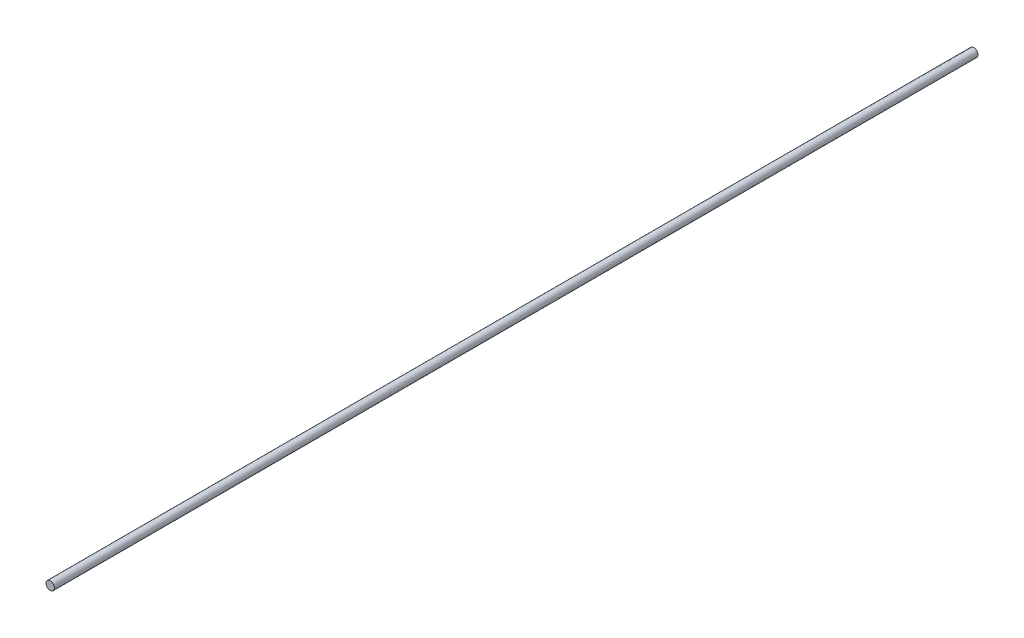
ISO-10303-21;
HEADER;
FILE_DESCRIPTION(('STEP AP214'),'2;1');
FILE_NAME('part.step','',(''),(''),'','','');
FILE_SCHEMA(('AUTOMOTIVE_DESIGN { 1 0 10303 214 1 1 1 1 }'));
ENDSEC;
DATA;
#1=APPLICATION_CONTEXT('core data for automotive mechanical design processes');
#2=APPLICATION_PROTOCOL_DEFINITION('international standard','automotive_design',2000,#1);
#3=PRODUCT_CONTEXT('',#1,'mechanical');
#4=PRODUCT('Part','Part','',(#3));
#5=PRODUCT_RELATED_PRODUCT_CATEGORY('part','',(#4));
#6=PRODUCT_DEFINITION_FORMATION('','',#4);
#7=PRODUCT_DEFINITION_CONTEXT('part definition',#1,'design');
#8=PRODUCT_DEFINITION('design','',#6,#7);
#9=PRODUCT_DEFINITION_SHAPE('','',#8);
#10=(LENGTH_UNIT() NAMED_UNIT(*) SI_UNIT(.MILLI.,.METRE.));
#11=(NAMED_UNIT(*) PLANE_ANGLE_UNIT() SI_UNIT($,.RADIAN.));
#12=(NAMED_UNIT(*) SI_UNIT($,.STERADIAN.) SOLID_ANGLE_UNIT());
#13=UNCERTAINTY_MEASURE_WITH_UNIT(LENGTH_MEASURE(1.E-05),#10,'distance_accuracy_value','');
#14=(GEOMETRIC_REPRESENTATION_CONTEXT(3) GLOBAL_UNCERTAINTY_ASSIGNED_CONTEXT((#13)) GLOBAL_UNIT_ASSIGNED_CONTEXT((#10,
#11,#12)) REPRESENTATION_CONTEXT('',''));
#15=CARTESIAN_POINT('',(0.,0.,0.));
#16=DIRECTION('',(0.,0.,1.));
#17=DIRECTION('',(1.,0.,0.));
#18=AXIS2_PLACEMENT_3D('',#15,#16,#17);
#19=CARTESIAN_POINT('',(0.,0.,330.5988));
#20=DIRECTION('',(0.,0.,-1.));
#21=DIRECTION('',(-1.,0.,0.));
#22=AXIS2_PLACEMENT_3D('',#19,#20,#21);
#23=CYLINDRICAL_SURFACE('',#22,1.5);
#24=CARTESIAN_POINT('',(0.,0.,330.5988));
#25=DIRECTION('',(0.,0.,1.));
#26=DIRECTION('',(1.,0.,0.));
#27=AXIS2_PLACEMENT_3D('',#24,#25,#26);
#28=CIRCLE('',#27,1.5);
#29=CARTESIAN_POINT('',(1.5,0.,330.5988));
#30=VERTEX_POINT('',#29);
#31=EDGE_CURVE('E10',#30,#30,#28,.T.);
#32=ORIENTED_EDGE('',*,*,#31,.F.);
#33=EDGE_LOOP('',(#32));
#34=FACE_BOUND('',#33,.T.);
#35=CARTESIAN_POINT('',(0.,0.,0.));
#36=DIRECTION('',(0.,0.,1.));
#37=DIRECTION('',(1.,0.,0.));
#38=AXIS2_PLACEMENT_3D('',#35,#36,#37);
#39=CIRCLE('',#38,1.5);
#40=CARTESIAN_POINT('',(1.5,0.,0.));
#41=VERTEX_POINT('',#40);
#42=EDGE_CURVE('E36',#41,#41,#39,.T.);
#43=ORIENTED_EDGE('',*,*,#42,.T.);
#44=EDGE_LOOP('',(#43));
#45=FACE_BOUND('',#44,.T.);
#46=ADVANCED_FACE('F33',(#34,#45),#23,.T.);
#47=CARTESIAN_POINT('',(0.,0.,330.5988));
#48=DIRECTION('',(0.,0.,1.));
#49=DIRECTION('',(1.,0.,0.));
#50=AXIS2_PLACEMENT_3D('',#47,#48,#49);
#51=PLANE('',#50);
#52=ORIENTED_EDGE('',*,*,#31,.T.);
#53=EDGE_LOOP('',(#52));
#54=FACE_BOUND('',#53,.T.);
#55=ADVANCED_FACE('F48',(#54),#51,.T.);
#56=CARTESIAN_POINT('',(0.,0.,0.));
#57=DIRECTION('',(0.,0.,1.));
#58=DIRECTION('',(1.,0.,0.));
#59=AXIS2_PLACEMENT_3D('',#56,#57,#58);
#60=PLANE('',#59);
#61=ORIENTED_EDGE('',*,*,#42,.F.);
#62=EDGE_LOOP('',(#61));
#63=FACE_BOUND('',#62,.T.);
#64=ADVANCED_FACE('F46',(#63),#60,.F.);
#65=CLOSED_SHELL('',(#46,#55,#64));
#66=MANIFOLD_SOLID_BREP('B2',#65);
#67=ADVANCED_BREP_SHAPE_REPRESENTATION('',(#18,#66),#14);
#68=SHAPE_DEFINITION_REPRESENTATION(#9,#67);
ENDSEC;
END-ISO-10303-21;
